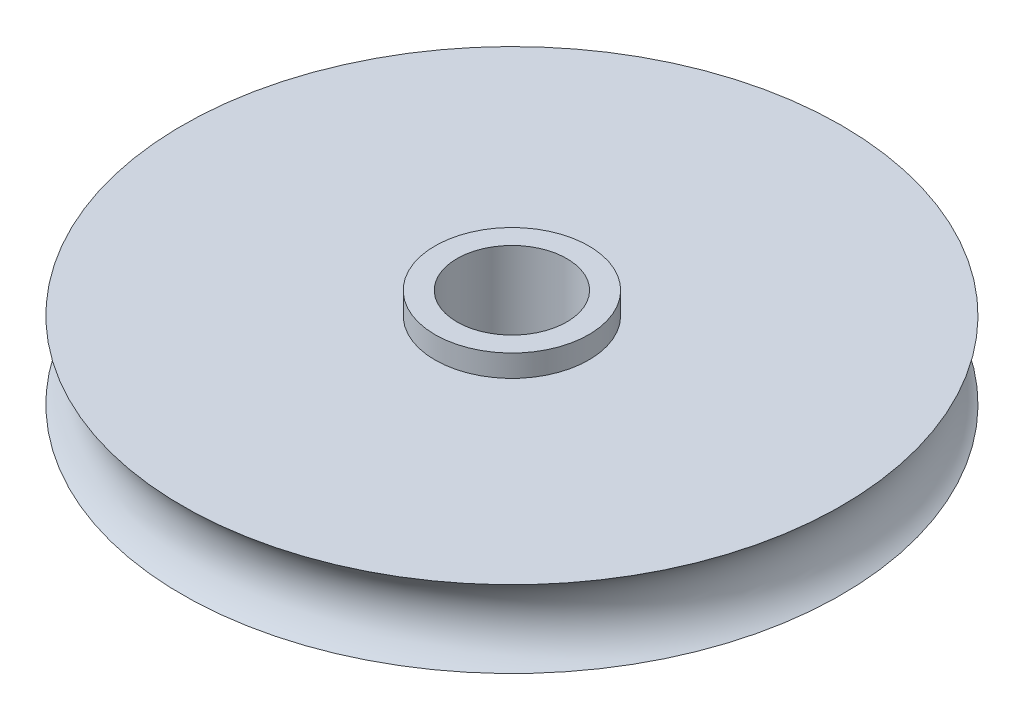
ISO-10303-21;
HEADER;
FILE_DESCRIPTION(('STEP AP214'),'2;1');
FILE_NAME('part.step','',(''),(''),'','','');
FILE_SCHEMA(('AUTOMOTIVE_DESIGN { 1 0 10303 214 1 1 1 1 }'));
ENDSEC;
DATA;
#1=APPLICATION_CONTEXT('core data for automotive mechanical design processes');
#2=APPLICATION_PROTOCOL_DEFINITION('international standard','automotive_design',2000,#1);
#3=PRODUCT_CONTEXT('',#1,'mechanical');
#4=PRODUCT('Part','Part','',(#3));
#5=PRODUCT_RELATED_PRODUCT_CATEGORY('part','',(#4));
#6=PRODUCT_DEFINITION_FORMATION('','',#4);
#7=PRODUCT_DEFINITION_CONTEXT('part definition',#1,'design');
#8=PRODUCT_DEFINITION('design','',#6,#7);
#9=PRODUCT_DEFINITION_SHAPE('','',#8);
#10=(LENGTH_UNIT() NAMED_UNIT(*) SI_UNIT(.MILLI.,.METRE.));
#11=(NAMED_UNIT(*) PLANE_ANGLE_UNIT() SI_UNIT($,.RADIAN.));
#12=(NAMED_UNIT(*) SI_UNIT($,.STERADIAN.) SOLID_ANGLE_UNIT());
#13=UNCERTAINTY_MEASURE_WITH_UNIT(LENGTH_MEASURE(1.E-05),#10,'distance_accuracy_value','');
#14=(GEOMETRIC_REPRESENTATION_CONTEXT(3) GLOBAL_UNCERTAINTY_ASSIGNED_CONTEXT((#13)) GLOBAL_UNIT_ASSIGNED_CONTEXT((#10,
#11,#12)) REPRESENTATION_CONTEXT('',''));
#15=CARTESIAN_POINT('',(0.,0.,0.));
#16=DIRECTION('',(0.,0.,1.));
#17=DIRECTION('',(1.,0.,0.));
#18=AXIS2_PLACEMENT_3D('',#15,#16,#17);
#19=CARTESIAN_POINT('',(0.,3.5,0.));
#20=DIRECTION('',(0.,1.,0.));
#21=DIRECTION('',(0.,0.,1.));
#22=AXIS2_PLACEMENT_3D('',#19,#20,#21);
#23=PLANE('',#22);
#24=CARTESIAN_POINT('',(0.,3.5,0.));
#25=DIRECTION('',(0.,1.,0.));
#26=DIRECTION('',(0.,0.,1.));
#27=AXIS2_PLACEMENT_3D('',#24,#25,#26);
#28=CIRCLE('',#27,3.5);
#29=CARTESIAN_POINT('',(0.,3.5,3.5));
#30=VERTEX_POINT('',#29);
#31=EDGE_CURVE('E10',#30,#30,#28,.T.);
#32=ORIENTED_EDGE('',*,*,#31,.F.);
#33=EDGE_LOOP('',(#32));
#34=FACE_BOUND('',#33,.T.);
#35=CARTESIAN_POINT('',(0.,3.5,0.));
#36=DIRECTION('',(0.,-1.,0.));
#37=DIRECTION('',(0.,0.,-1.));
#38=AXIS2_PLACEMENT_3D('',#35,#36,#37);
#39=CIRCLE('',#38,15.);
#40=CARTESIAN_POINT('',(0.,3.5,-15.));
#41=VERTEX_POINT('',#40);
#42=EDGE_CURVE('E37',#41,#41,#39,.F.);
#43=ORIENTED_EDGE('',*,*,#42,.T.);
#44=EDGE_LOOP('',(#43));
#45=FACE_BOUND('',#44,.T.);
#46=ADVANCED_FACE('F33',(#34,#45),#23,.T.);
#47=CARTESIAN_POINT('',(0.,1.75,0.));
#48=DIRECTION('',(0.,-1.,0.));
#49=DIRECTION('',(0.,0.,-1.));
#50=AXIS2_PLACEMENT_3D('',#47,#48,#49);
#51=TOROIDAL_SURFACE('',#50,16.2,2.12190951739229);
#52=ORIENTED_EDGE('',*,*,#42,.F.);
#53=EDGE_LOOP('',(#52));
#54=FACE_BOUND('',#53,.T.);
#55=CARTESIAN_POINT('',(0.,0.,0.));
#56=DIRECTION('',(0.,-1.,0.));
#57=DIRECTION('',(0.,0.,-1.));
#58=AXIS2_PLACEMENT_3D('',#55,#56,#57);
#59=CIRCLE('',#58,15.);
#60=CARTESIAN_POINT('',(0.,0.,-15.));
#61=VERTEX_POINT('',#60);
#62=EDGE_CURVE('E53',#61,#61,#59,.F.);
#63=ORIENTED_EDGE('',*,*,#62,.T.);
#64=EDGE_LOOP('',(#63));
#65=FACE_BOUND('',#64,.T.);
#66=ADVANCED_FACE('F61',(#54,#65),#51,.F.);
#67=CARTESIAN_POINT('',(0.,0.,0.));
#68=DIRECTION('',(0.,1.,0.));
#69=DIRECTION('',(0.,0.,1.));
#70=AXIS2_PLACEMENT_3D('',#67,#68,#69);
#71=PLANE('',#70);
#72=CARTESIAN_POINT('',(0.,0.,0.));
#73=DIRECTION('',(0.,-1.,0.));
#74=DIRECTION('',(0.,0.,-1.));
#75=AXIS2_PLACEMENT_3D('',#72,#73,#74);
#76=CIRCLE('',#75,3.5);
#77=CARTESIAN_POINT('',(0.,0.,-3.5));
#78=VERTEX_POINT('',#77);
#79=EDGE_CURVE('E41',#78,#78,#76,.T.);
#80=ORIENTED_EDGE('',*,*,#79,.F.);
#81=EDGE_LOOP('',(#80));
#82=FACE_BOUND('',#81,.T.);
#83=ORIENTED_EDGE('',*,*,#62,.F.);
#84=EDGE_LOOP('',(#83));
#85=FACE_BOUND('',#84,.T.);
#86=ADVANCED_FACE('F35',(#82,#85),#71,.F.);
#87=CARTESIAN_POINT('',(0.,-1.,0.));
#88=DIRECTION('',(0.,1.,0.));
#89=DIRECTION('',(0.,0.,1.));
#90=AXIS2_PLACEMENT_3D('',#87,#88,#89);
#91=CYLINDRICAL_SURFACE('',#90,3.5);
#92=CARTESIAN_POINT('',(0.,-1.,0.));
#93=DIRECTION('',(0.,-1.,0.));
#94=DIRECTION('',(0.,0.,-1.));
#95=AXIS2_PLACEMENT_3D('',#92,#93,#94);
#96=CIRCLE('',#95,3.5);
#97=CARTESIAN_POINT('',(0.,-1.,-3.5));
#98=VERTEX_POINT('',#97);
#99=EDGE_CURVE('E51',#98,#98,#96,.T.);
#100=ORIENTED_EDGE('',*,*,#99,.F.);
#101=EDGE_LOOP('',(#100));
#102=FACE_BOUND('',#101,.T.);
#103=ORIENTED_EDGE('',*,*,#79,.T.);
#104=EDGE_LOOP('',(#103));
#105=FACE_BOUND('',#104,.T.);
#106=ADVANCED_FACE('F68',(#102,#105),#91,.T.);
#107=CARTESIAN_POINT('',(0.,-1.,0.));
#108=DIRECTION('',(0.,-1.,0.));
#109=DIRECTION('',(0.,0.,-1.));
#110=AXIS2_PLACEMENT_3D('',#107,#108,#109);
#111=PLANE('',#110);
#112=CARTESIAN_POINT('',(0.,-1.,0.));
#113=DIRECTION('',(0.,1.,0.));
#114=DIRECTION('',(0.,0.,1.));
#115=AXIS2_PLACEMENT_3D('',#112,#113,#114);
#116=CIRCLE('',#115,2.5);
#117=CARTESIAN_POINT('',(0.,-1.,2.5));
#118=VERTEX_POINT('',#117);
#119=EDGE_CURVE('E95',#118,#118,#116,.T.);
#120=ORIENTED_EDGE('',*,*,#119,.T.);
#121=EDGE_LOOP('',(#120));
#122=FACE_BOUND('',#121,.T.);
#123=ORIENTED_EDGE('',*,*,#99,.T.);
#124=EDGE_LOOP('',(#123));
#125=FACE_BOUND('',#124,.T.);
#126=ADVANCED_FACE('F74',(#122,#125),#111,.T.);
#127=CARTESIAN_POINT('',(0.,4.5,0.));
#128=DIRECTION('',(0.,-1.,0.));
#129=DIRECTION('',(0.,0.,-1.));
#130=AXIS2_PLACEMENT_3D('',#127,#128,#129);
#131=CYLINDRICAL_SURFACE('',#130,3.5);
#132=CARTESIAN_POINT('',(0.,4.5,0.));
#133=DIRECTION('',(0.,1.,0.));
#134=DIRECTION('',(0.,0.,1.));
#135=AXIS2_PLACEMENT_3D('',#132,#133,#134);
#136=CIRCLE('',#135,3.5);
#137=CARTESIAN_POINT('',(0.,4.5,3.5));
#138=VERTEX_POINT('',#137);
#139=EDGE_CURVE('E49',#138,#138,#136,.T.);
#140=ORIENTED_EDGE('',*,*,#139,.F.);
#141=EDGE_LOOP('',(#140));
#142=FACE_BOUND('',#141,.T.);
#143=ORIENTED_EDGE('',*,*,#31,.T.);
#144=EDGE_LOOP('',(#143));
#145=FACE_BOUND('',#144,.T.);
#146=ADVANCED_FACE('F78',(#142,#145),#131,.T.);
#147=CARTESIAN_POINT('',(0.,4.5,0.));
#148=DIRECTION('',(0.,1.,0.));
#149=DIRECTION('',(0.,0.,1.));
#150=AXIS2_PLACEMENT_3D('',#147,#148,#149);
#151=PLANE('',#150);
#152=CARTESIAN_POINT('',(0.,4.5,0.));
#153=DIRECTION('',(0.,1.,0.));
#154=DIRECTION('',(0.,0.,1.));
#155=AXIS2_PLACEMENT_3D('',#152,#153,#154);
#156=CIRCLE('',#155,2.5);
#157=CARTESIAN_POINT('',(0.,4.5,2.5));
#158=VERTEX_POINT('',#157);
#159=EDGE_CURVE('E98',#158,#158,#156,.T.);
#160=ORIENTED_EDGE('',*,*,#159,.F.);
#161=EDGE_LOOP('',(#160));
#162=FACE_BOUND('',#161,.T.);
#163=ORIENTED_EDGE('',*,*,#139,.T.);
#164=EDGE_LOOP('',(#163));
#165=FACE_BOUND('',#164,.T.);
#166=ADVANCED_FACE('F82',(#162,#165),#151,.T.);
#167=CARTESIAN_POINT('',(0.,-1.,0.));
#168=DIRECTION('',(0.,1.,0.));
#169=DIRECTION('',(0.,0.,1.));
#170=AXIS2_PLACEMENT_3D('',#167,#168,#169);
#171=CYLINDRICAL_SURFACE('',#170,2.5);
#172=ORIENTED_EDGE('',*,*,#119,.F.);
#173=EDGE_LOOP('',(#172));
#174=FACE_BOUND('',#173,.T.);
#175=ORIENTED_EDGE('',*,*,#159,.T.);
#176=EDGE_LOOP('',(#175));
#177=FACE_BOUND('',#176,.T.);
#178=ADVANCED_FACE('F86',(#174,#177),#171,.F.);
#179=CLOSED_SHELL('',(#46,#66,#86,#106,#126,#146,#166,#178));
#180=MANIFOLD_SOLID_BREP('B2',#179);
#181=ADVANCED_BREP_SHAPE_REPRESENTATION('',(#18,#180),#14);
#182=SHAPE_DEFINITION_REPRESENTATION(#9,#181);
ENDSEC;
END-ISO-10303-21;
